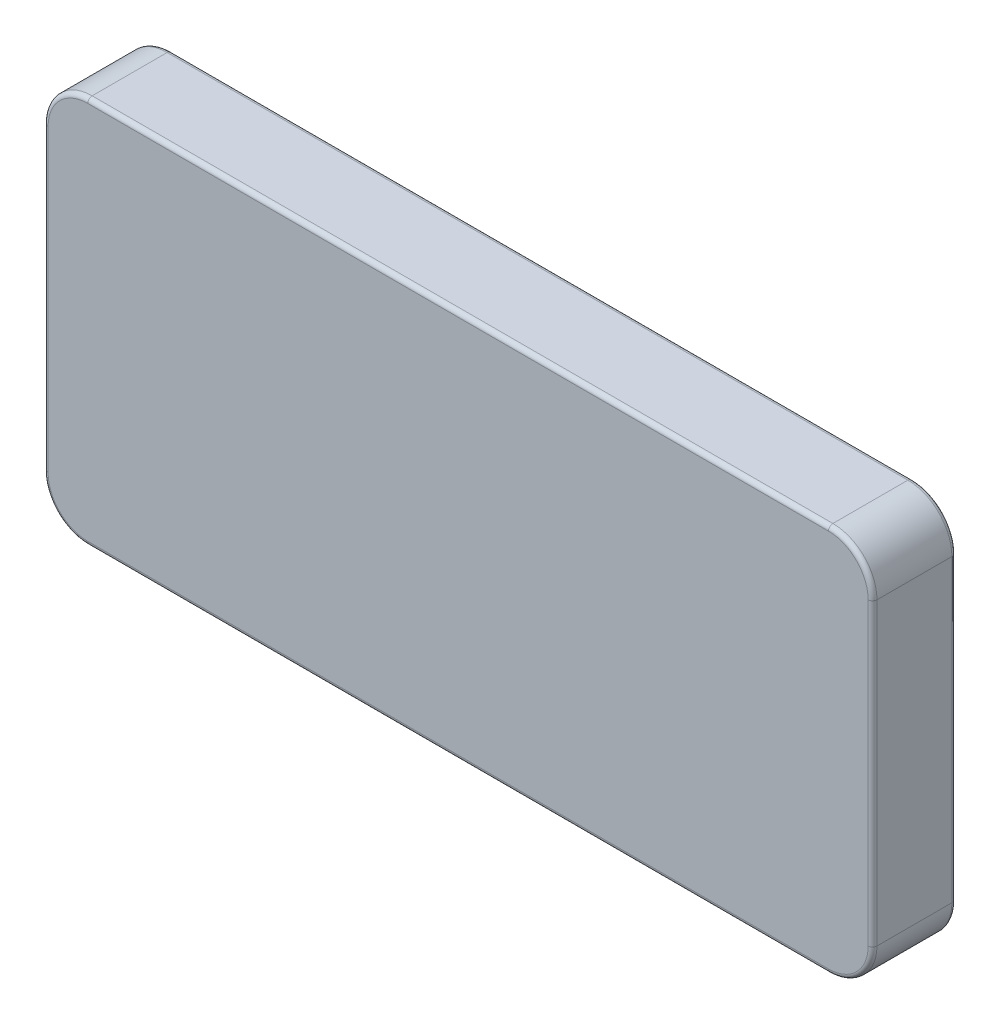
ISO-10303-21;
HEADER;
FILE_DESCRIPTION(('STEP AP214'),'2;1');
FILE_NAME('part.step','',(''),(''),'','','');
FILE_SCHEMA(('AUTOMOTIVE_DESIGN { 1 0 10303 214 1 1 1 1 }'));
ENDSEC;
DATA;
#1=APPLICATION_CONTEXT('core data for automotive mechanical design processes');
#2=APPLICATION_PROTOCOL_DEFINITION('international standard','automotive_design',2000,#1);
#3=PRODUCT_CONTEXT('',#1,'mechanical');
#4=PRODUCT('Part','Part','',(#3));
#5=PRODUCT_RELATED_PRODUCT_CATEGORY('part','',(#4));
#6=PRODUCT_DEFINITION_FORMATION('','',#4);
#7=PRODUCT_DEFINITION_CONTEXT('part definition',#1,'design');
#8=PRODUCT_DEFINITION('design','',#6,#7);
#9=PRODUCT_DEFINITION_SHAPE('','',#8);
#10=(LENGTH_UNIT() NAMED_UNIT(*) SI_UNIT(.MILLI.,.METRE.));
#11=(NAMED_UNIT(*) PLANE_ANGLE_UNIT() SI_UNIT($,.RADIAN.));
#12=(NAMED_UNIT(*) SI_UNIT($,.STERADIAN.) SOLID_ANGLE_UNIT());
#13=UNCERTAINTY_MEASURE_WITH_UNIT(LENGTH_MEASURE(1.E-05),#10,'distance_accuracy_value','');
#14=(GEOMETRIC_REPRESENTATION_CONTEXT(3) GLOBAL_UNCERTAINTY_ASSIGNED_CONTEXT((#13)) GLOBAL_UNIT_ASSIGNED_CONTEXT((#10,
#11,#12)) REPRESENTATION_CONTEXT('',''));
#15=CARTESIAN_POINT('',(0.,0.,0.));
#16=DIRECTION('',(0.,0.,1.));
#17=DIRECTION('',(1.,0.,0.));
#18=AXIS2_PLACEMENT_3D('',#15,#16,#17);
#19=CARTESIAN_POINT('',(0.,0.,190.));
#20=DIRECTION('',(1.,0.,0.));
#21=DIRECTION('',(0.,0.,-1.));
#22=AXIS2_PLACEMENT_3D('',#19,#20,#21);
#23=PLANE('',#22);
#24=DIRECTION('',(0.,0.,-1.));
#25=VECTOR('',#24,1.);
#26=CARTESIAN_POINT('',(0.,780.,190.));
#27=LINE('',#26,#25);
#28=CARTESIAN_POINT('',(0.,780.,180.));
#29=VERTEX_POINT('',#28);
#30=CARTESIAN_POINT('',(0.,780.,10.));
#31=VERTEX_POINT('',#30);
#32=EDGE_CURVE('E280',#29,#31,#27,.T.);
#33=ORIENTED_EDGE('',*,*,#32,.T.);
#34=DIRECTION('',(0.,-1.,0.));
#35=VECTOR('',#34,1.);
#36=CARTESIAN_POINT('',(0.,100.,10.));
#37=LINE('',#36,#35);
#38=CARTESIAN_POINT('',(0.,100.,10.));
#39=VERTEX_POINT('',#38);
#40=EDGE_CURVE('E207',#31,#39,#37,.T.);
#41=ORIENTED_EDGE('',*,*,#40,.T.);
#42=DIRECTION('',(0.,0.,-1.));
#43=VECTOR('',#42,1.);
#44=CARTESIAN_POINT('',(0.,100.,190.));
#45=LINE('',#44,#43);
#46=CARTESIAN_POINT('',(0.,100.,180.));
#47=VERTEX_POINT('',#46);
#48=EDGE_CURVE('E238',#39,#47,#45,.F.);
#49=ORIENTED_EDGE('',*,*,#48,.T.);
#50=DIRECTION('',(0.,-1.,0.));
#51=VECTOR('',#50,1.);
#52=CARTESIAN_POINT('',(0.,0.,180.));
#53=LINE('',#52,#51);
#54=EDGE_CURVE('E205',#47,#29,#53,.F.);
#55=ORIENTED_EDGE('',*,*,#54,.T.);
#56=EDGE_LOOP('',(#33,#41,#49,#55));
#57=FACE_BOUND('',#56,.T.);
#58=ADVANCED_FACE('F33',(#57),#23,.F.);
#59=CARTESIAN_POINT('',(0.,0.,190.));
#60=DIRECTION('',(0.,1.,0.));
#61=DIRECTION('',(0.,0.,1.));
#62=AXIS2_PLACEMENT_3D('',#59,#60,#61);
#63=PLANE('',#62);
#64=DIRECTION('',(0.,0.,-1.));
#65=VECTOR('',#64,1.);
#66=CARTESIAN_POINT('',(100.,0.,190.));
#67=LINE('',#66,#65);
#68=CARTESIAN_POINT('',(100.,0.,180.));
#69=VERTEX_POINT('',#68);
#70=CARTESIAN_POINT('',(100.,0.,10.));
#71=VERTEX_POINT('',#70);
#72=EDGE_CURVE('E276',#69,#71,#67,.T.);
#73=ORIENTED_EDGE('',*,*,#72,.T.);
#74=DIRECTION('',(1.,0.,0.));
#75=VECTOR('',#74,1.);
#76=CARTESIAN_POINT('',(1780.,0.,10.));
#77=LINE('',#76,#75);
#78=CARTESIAN_POINT('',(1780.,0.,10.));
#79=VERTEX_POINT('',#78);
#80=EDGE_CURVE('E182',#71,#79,#77,.T.);
#81=ORIENTED_EDGE('',*,*,#80,.T.);
#82=DIRECTION('',(0.,0.,-1.));
#83=VECTOR('',#82,1.);
#84=CARTESIAN_POINT('',(1780.,0.,190.));
#85=LINE('',#84,#83);
#86=CARTESIAN_POINT('',(1780.,0.,180.));
#87=VERTEX_POINT('',#86);
#88=EDGE_CURVE('E290',#79,#87,#85,.F.);
#89=ORIENTED_EDGE('',*,*,#88,.T.);
#90=DIRECTION('',(1.,0.,0.));
#91=VECTOR('',#90,1.);
#92=CARTESIAN_POINT('',(0.,0.,180.));
#93=LINE('',#92,#91);
#94=EDGE_CURVE('E180',#87,#69,#93,.F.);
#95=ORIENTED_EDGE('',*,*,#94,.T.);
#96=EDGE_LOOP('',(#73,#81,#89,#95));
#97=FACE_BOUND('',#96,.T.);
#98=ADVANCED_FACE('F317',(#97),#63,.F.);
#99=CARTESIAN_POINT('',(1880.,0.,190.));
#100=DIRECTION('',(-1.,0.,0.));
#101=DIRECTION('',(0.,0.,1.));
#102=AXIS2_PLACEMENT_3D('',#99,#100,#101);
#103=PLANE('',#102);
#104=DIRECTION('',(0.,0.,-1.));
#105=VECTOR('',#104,1.);
#106=CARTESIAN_POINT('',(1880.,100.,190.));
#107=LINE('',#106,#105);
#108=CARTESIAN_POINT('',(1880.,100.,180.));
#109=VERTEX_POINT('',#108);
#110=CARTESIAN_POINT('',(1880.,100.,10.));
#111=VERTEX_POINT('',#110);
#112=EDGE_CURVE('E166',#109,#111,#107,.T.);
#113=ORIENTED_EDGE('',*,*,#112,.T.);
#114=DIRECTION('',(0.,1.,0.));
#115=VECTOR('',#114,1.);
#116=CARTESIAN_POINT('',(1880.,780.,10.));
#117=LINE('',#116,#115);
#118=CARTESIAN_POINT('',(1880.,780.,10.));
#119=VERTEX_POINT('',#118);
#120=EDGE_CURVE('E190',#111,#119,#117,.T.);
#121=ORIENTED_EDGE('',*,*,#120,.T.);
#122=DIRECTION('',(0.,0.,-1.));
#123=VECTOR('',#122,1.);
#124=CARTESIAN_POINT('',(1880.,780.,190.));
#125=LINE('',#124,#123);
#126=CARTESIAN_POINT('',(1880.,780.,180.));
#127=VERTEX_POINT('',#126);
#128=EDGE_CURVE('E294',#119,#127,#125,.F.);
#129=ORIENTED_EDGE('',*,*,#128,.T.);
#130=DIRECTION('',(0.,1.,0.));
#131=VECTOR('',#130,1.);
#132=CARTESIAN_POINT('',(1880.,0.,180.));
#133=LINE('',#132,#131);
#134=EDGE_CURVE('E188',#127,#109,#133,.F.);
#135=ORIENTED_EDGE('',*,*,#134,.T.);
#136=EDGE_LOOP('',(#113,#121,#129,#135));
#137=FACE_BOUND('',#136,.T.);
#138=ADVANCED_FACE('F361',(#137),#103,.F.);
#139=CARTESIAN_POINT('',(0.,880.,190.));
#140=DIRECTION('',(0.,-1.,0.));
#141=DIRECTION('',(0.,0.,-1.));
#142=AXIS2_PLACEMENT_3D('',#139,#140,#141);
#143=PLANE('',#142);
#144=DIRECTION('',(0.,0.,-1.));
#145=VECTOR('',#144,1.);
#146=CARTESIAN_POINT('',(1780.,880.,190.));
#147=LINE('',#146,#145);
#148=CARTESIAN_POINT('',(1780.,880.,180.));
#149=VERTEX_POINT('',#148);
#150=CARTESIAN_POINT('',(1780.,880.,10.));
#151=VERTEX_POINT('',#150);
#152=EDGE_CURVE('E282',#149,#151,#147,.T.);
#153=ORIENTED_EDGE('',*,*,#152,.T.);
#154=DIRECTION('',(-1.,0.,0.));
#155=VECTOR('',#154,1.);
#156=CARTESIAN_POINT('',(100.,880.,10.));
#157=LINE('',#156,#155);
#158=CARTESIAN_POINT('',(100.,880.,10.));
#159=VERTEX_POINT('',#158);
#160=EDGE_CURVE('E199',#151,#159,#157,.T.);
#161=ORIENTED_EDGE('',*,*,#160,.T.);
#162=DIRECTION('',(0.,0.,-1.));
#163=VECTOR('',#162,1.);
#164=CARTESIAN_POINT('',(100.,880.,190.));
#165=LINE('',#164,#163);
#166=CARTESIAN_POINT('',(100.,880.,180.));
#167=VERTEX_POINT('',#166);
#168=EDGE_CURVE('E287',#159,#167,#165,.F.);
#169=ORIENTED_EDGE('',*,*,#168,.T.);
#170=DIRECTION('',(-1.,0.,0.));
#171=VECTOR('',#170,1.);
#172=CARTESIAN_POINT('',(0.,880.,180.));
#173=LINE('',#172,#171);
#174=EDGE_CURVE('E197',#167,#149,#173,.F.);
#175=ORIENTED_EDGE('',*,*,#174,.T.);
#176=EDGE_LOOP('',(#153,#161,#169,#175));
#177=FACE_BOUND('',#176,.T.);
#178=ADVANCED_FACE('F345',(#177),#143,.F.);
#179=CARTESIAN_POINT('',(0.,0.,190.));
#180=DIRECTION('',(0.,0.,-1.));
#181=DIRECTION('',(-1.,0.,0.));
#182=AXIS2_PLACEMENT_3D('',#179,#180,#181);
#183=PLANE('',#182);
#184=DIRECTION('',(0.,1.,0.));
#185=VECTOR('',#184,1.);
#186=CARTESIAN_POINT('',(1870.,0.,190.));
#187=LINE('',#186,#185);
#188=CARTESIAN_POINT('',(1870.,100.,190.));
#189=VERTEX_POINT('',#188);
#190=CARTESIAN_POINT('',(1870.,780.,190.));
#191=VERTEX_POINT('',#190);
#192=EDGE_CURVE('E42',#189,#191,#187,.T.);
#193=ORIENTED_EDGE('',*,*,#192,.T.);
#194=CARTESIAN_POINT('',(1780.,780.,190.));
#195=DIRECTION('',(0.,0.,-1.));
#196=DIRECTION('',(-1.,0.,0.));
#197=AXIS2_PLACEMENT_3D('',#194,#195,#196);
#198=CIRCLE('',#197,90.);
#199=CARTESIAN_POINT('',(1780.,870.,190.));
#200=VERTEX_POINT('',#199);
#201=EDGE_CURVE('E11',#191,#200,#198,.F.);
#202=ORIENTED_EDGE('',*,*,#201,.T.);
#203=DIRECTION('',(-1.,0.,0.));
#204=VECTOR('',#203,1.);
#205=CARTESIAN_POINT('',(0.,870.,190.));
#206=LINE('',#205,#204);
#207=CARTESIAN_POINT('',(100.,870.,190.));
#208=VERTEX_POINT('',#207);
#209=EDGE_CURVE('E209',#200,#208,#206,.T.);
#210=ORIENTED_EDGE('',*,*,#209,.T.);
#211=CARTESIAN_POINT('',(100.,780.,190.));
#212=DIRECTION('',(0.,0.,-1.));
#213=DIRECTION('',(-1.,0.,0.));
#214=AXIS2_PLACEMENT_3D('',#211,#212,#213);
#215=CIRCLE('',#214,90.);
#216=CARTESIAN_POINT('',(10.,780.,190.));
#217=VERTEX_POINT('',#216);
#218=EDGE_CURVE('E211',#208,#217,#215,.F.);
#219=ORIENTED_EDGE('',*,*,#218,.T.);
#220=DIRECTION('',(0.,-1.,0.));
#221=VECTOR('',#220,1.);
#222=CARTESIAN_POINT('',(10.,0.,190.));
#223=LINE('',#222,#221);
#224=CARTESIAN_POINT('',(10.,100.,190.));
#225=VERTEX_POINT('',#224);
#226=EDGE_CURVE('E213',#217,#225,#223,.T.);
#227=ORIENTED_EDGE('',*,*,#226,.T.);
#228=CARTESIAN_POINT('',(100.,100.,190.));
#229=DIRECTION('',(0.,0.,-1.));
#230=DIRECTION('',(-1.,0.,0.));
#231=AXIS2_PLACEMENT_3D('',#228,#229,#230);
#232=CIRCLE('',#231,90.);
#233=CARTESIAN_POINT('',(100.,9.99999999999998,190.));
#234=VERTEX_POINT('',#233);
#235=EDGE_CURVE('E215',#225,#234,#232,.F.);
#236=ORIENTED_EDGE('',*,*,#235,.T.);
#237=DIRECTION('',(1.,0.,0.));
#238=VECTOR('',#237,1.);
#239=CARTESIAN_POINT('',(0.,10.,190.));
#240=LINE('',#239,#238);
#241=CARTESIAN_POINT('',(1780.,10.,190.));
#242=VERTEX_POINT('',#241);
#243=EDGE_CURVE('E217',#234,#242,#240,.T.);
#244=ORIENTED_EDGE('',*,*,#243,.T.);
#245=CARTESIAN_POINT('',(1780.,100.,190.));
#246=DIRECTION('',(0.,0.,-1.));
#247=DIRECTION('',(-1.,0.,0.));
#248=AXIS2_PLACEMENT_3D('',#245,#246,#247);
#249=CIRCLE('',#248,90.);
#250=EDGE_CURVE('E53',#242,#189,#249,.F.);
#251=ORIENTED_EDGE('',*,*,#250,.T.);
#252=EDGE_LOOP('',(#193,#202,#210,#219,#227,#236,#244,#251));
#253=FACE_BOUND('',#252,.T.);
#254=ADVANCED_FACE('F333',(#253),#183,.F.);
#255=CARTESIAN_POINT('',(0.,0.,0.));
#256=DIRECTION('',(0.,0.,-1.));
#257=DIRECTION('',(-1.,0.,0.));
#258=AXIS2_PLACEMENT_3D('',#255,#256,#257);
#259=PLANE('',#258);
#260=DIRECTION('',(1.,0.,0.));
#261=VECTOR('',#260,1.);
#262=CARTESIAN_POINT('',(100.,10.,0.));
#263=LINE('',#262,#261);
#264=CARTESIAN_POINT('',(1780.,9.99999999999998,0.));
#265=VERTEX_POINT('',#264);
#266=CARTESIAN_POINT('',(100.,10.,0.));
#267=VERTEX_POINT('',#266);
#268=EDGE_CURVE('E170',#265,#267,#263,.F.);
#269=ORIENTED_EDGE('',*,*,#268,.T.);
#270=CARTESIAN_POINT('',(100.,100.,0.));
#271=DIRECTION('',(0.,0.,-1.));
#272=DIRECTION('',(-1.,0.,0.));
#273=AXIS2_PLACEMENT_3D('',#270,#271,#272);
#274=CIRCLE('',#273,90.);
#275=CARTESIAN_POINT('',(10.,100.,0.));
#276=VERTEX_POINT('',#275);
#277=EDGE_CURVE('E151',#267,#276,#274,.T.);
#278=ORIENTED_EDGE('',*,*,#277,.T.);
#279=DIRECTION('',(0.,-1.,0.));
#280=VECTOR('',#279,1.);
#281=CARTESIAN_POINT('',(10.,780.,0.));
#282=LINE('',#281,#280);
#283=CARTESIAN_POINT('',(10.,780.,0.));
#284=VERTEX_POINT('',#283);
#285=EDGE_CURVE('E159',#276,#284,#282,.F.);
#286=ORIENTED_EDGE('',*,*,#285,.T.);
#287=CARTESIAN_POINT('',(100.,780.,0.));
#288=DIRECTION('',(0.,0.,-1.));
#289=DIRECTION('',(-1.,0.,0.));
#290=AXIS2_PLACEMENT_3D('',#287,#288,#289);
#291=CIRCLE('',#290,90.);
#292=CARTESIAN_POINT('',(100.,870.,0.));
#293=VERTEX_POINT('',#292);
#294=EDGE_CURVE('E165',#284,#293,#291,.T.);
#295=ORIENTED_EDGE('',*,*,#294,.T.);
#296=DIRECTION('',(-1.,0.,0.));
#297=VECTOR('',#296,1.);
#298=CARTESIAN_POINT('',(1780.,870.,0.));
#299=LINE('',#298,#297);
#300=CARTESIAN_POINT('',(1780.,870.,0.));
#301=VERTEX_POINT('',#300);
#302=EDGE_CURVE('E300',#293,#301,#299,.F.);
#303=ORIENTED_EDGE('',*,*,#302,.T.);
#304=CARTESIAN_POINT('',(1780.,780.,0.));
#305=DIRECTION('',(0.,0.,-1.));
#306=DIRECTION('',(-1.,0.,0.));
#307=AXIS2_PLACEMENT_3D('',#304,#305,#306);
#308=CIRCLE('',#307,90.);
#309=CARTESIAN_POINT('',(1870.,780.,0.));
#310=VERTEX_POINT('',#309);
#311=EDGE_CURVE('E302',#301,#310,#308,.T.);
#312=ORIENTED_EDGE('',*,*,#311,.T.);
#313=DIRECTION('',(0.,1.,0.));
#314=VECTOR('',#313,1.);
#315=CARTESIAN_POINT('',(1870.,100.,0.));
#316=LINE('',#315,#314);
#317=CARTESIAN_POINT('',(1870.,100.,0.));
#318=VERTEX_POINT('',#317);
#319=EDGE_CURVE('E304',#310,#318,#316,.F.);
#320=ORIENTED_EDGE('',*,*,#319,.T.);
#321=CARTESIAN_POINT('',(1780.,100.,0.));
#322=DIRECTION('',(0.,0.,-1.));
#323=DIRECTION('',(-1.,0.,0.));
#324=AXIS2_PLACEMENT_3D('',#321,#322,#323);
#325=CIRCLE('',#324,90.);
#326=EDGE_CURVE('E175',#318,#265,#325,.T.);
#327=ORIENTED_EDGE('',*,*,#326,.T.);
#328=EDGE_LOOP('',(#269,#278,#286,#295,#303,#312,#320,#327));
#329=FACE_BOUND('',#328,.T.);
#330=ADVANCED_FACE('F168',(#329),#259,.T.);
#331=CARTESIAN_POINT('',(100.,780.,190.));
#332=DIRECTION('',(0.,0.,-1.));
#333=DIRECTION('',(-1.,0.,0.));
#334=AXIS2_PLACEMENT_3D('',#331,#332,#333);
#335=CYLINDRICAL_SURFACE('',#334,100.);
#336=ORIENTED_EDGE('',*,*,#168,.F.);
#337=CARTESIAN_POINT('',(100.,780.,10.));
#338=DIRECTION('',(0.,0.,-1.));
#339=DIRECTION('',(-1.,0.,0.));
#340=AXIS2_PLACEMENT_3D('',#337,#338,#339);
#341=CIRCLE('',#340,100.);
#342=EDGE_CURVE('E203',#159,#31,#341,.F.);
#343=ORIENTED_EDGE('',*,*,#342,.T.);
#344=ORIENTED_EDGE('',*,*,#32,.F.);
#345=CARTESIAN_POINT('',(100.,780.,180.));
#346=DIRECTION('',(0.,0.,-1.));
#347=DIRECTION('',(-1.,0.,0.));
#348=AXIS2_PLACEMENT_3D('',#345,#346,#347);
#349=CIRCLE('',#348,100.);
#350=EDGE_CURVE('E201',#29,#167,#349,.T.);
#351=ORIENTED_EDGE('',*,*,#350,.T.);
#352=EDGE_LOOP('',(#336,#343,#344,#351));
#353=FACE_BOUND('',#352,.T.);
#354=ADVANCED_FACE('F375',(#353),#335,.T.);
#355=CARTESIAN_POINT('',(100.,100.,190.));
#356=DIRECTION('',(0.,0.,-1.));
#357=DIRECTION('',(-1.,0.,0.));
#358=AXIS2_PLACEMENT_3D('',#355,#356,#357);
#359=CYLINDRICAL_SURFACE('',#358,100.);
#360=ORIENTED_EDGE('',*,*,#48,.F.);
#361=CARTESIAN_POINT('',(100.,100.,10.));
#362=DIRECTION('',(0.,0.,-1.));
#363=DIRECTION('',(-1.,0.,0.));
#364=AXIS2_PLACEMENT_3D('',#361,#362,#363);
#365=CIRCLE('',#364,100.);
#366=EDGE_CURVE('E153',#39,#71,#365,.F.);
#367=ORIENTED_EDGE('',*,*,#366,.T.);
#368=ORIENTED_EDGE('',*,*,#72,.F.);
#369=CARTESIAN_POINT('',(100.,100.,180.));
#370=DIRECTION('',(0.,0.,-1.));
#371=DIRECTION('',(-1.,0.,0.));
#372=AXIS2_PLACEMENT_3D('',#369,#370,#371);
#373=CIRCLE('',#372,100.);
#374=EDGE_CURVE('E172',#69,#47,#373,.T.);
#375=ORIENTED_EDGE('',*,*,#374,.T.);
#376=EDGE_LOOP('',(#360,#367,#368,#375));
#377=FACE_BOUND('',#376,.T.);
#378=ADVANCED_FACE('F274',(#377),#359,.T.);
#379=CARTESIAN_POINT('',(1780.,100.,190.));
#380=DIRECTION('',(0.,0.,-1.));
#381=DIRECTION('',(-1.,0.,0.));
#382=AXIS2_PLACEMENT_3D('',#379,#380,#381);
#383=CYLINDRICAL_SURFACE('',#382,100.);
#384=ORIENTED_EDGE('',*,*,#88,.F.);
#385=CARTESIAN_POINT('',(1780.,100.,10.));
#386=DIRECTION('',(0.,0.,-1.));
#387=DIRECTION('',(-1.,0.,0.));
#388=AXIS2_PLACEMENT_3D('',#385,#386,#387);
#389=CIRCLE('',#388,100.);
#390=EDGE_CURVE('E186',#79,#111,#389,.F.);
#391=ORIENTED_EDGE('',*,*,#390,.T.);
#392=ORIENTED_EDGE('',*,*,#112,.F.);
#393=CARTESIAN_POINT('',(1780.,100.,180.));
#394=DIRECTION('',(0.,0.,-1.));
#395=DIRECTION('',(-1.,0.,0.));
#396=AXIS2_PLACEMENT_3D('',#393,#394,#395);
#397=CIRCLE('',#396,100.);
#398=EDGE_CURVE('E184',#109,#87,#397,.T.);
#399=ORIENTED_EDGE('',*,*,#398,.T.);
#400=EDGE_LOOP('',(#384,#391,#392,#399));
#401=FACE_BOUND('',#400,.T.);
#402=ADVANCED_FACE('F319',(#401),#383,.T.);
#403=CARTESIAN_POINT('',(1780.,780.,190.));
#404=DIRECTION('',(0.,0.,-1.));
#405=DIRECTION('',(-1.,0.,0.));
#406=AXIS2_PLACEMENT_3D('',#403,#404,#405);
#407=CYLINDRICAL_SURFACE('',#406,100.);
#408=ORIENTED_EDGE('',*,*,#128,.F.);
#409=CARTESIAN_POINT('',(1780.,780.,10.));
#410=DIRECTION('',(0.,0.,-1.));
#411=DIRECTION('',(-1.,0.,0.));
#412=AXIS2_PLACEMENT_3D('',#409,#410,#411);
#413=CIRCLE('',#412,100.);
#414=EDGE_CURVE('E195',#119,#151,#413,.F.);
#415=ORIENTED_EDGE('',*,*,#414,.T.);
#416=ORIENTED_EDGE('',*,*,#152,.F.);
#417=CARTESIAN_POINT('',(1780.,780.,180.));
#418=DIRECTION('',(0.,0.,-1.));
#419=DIRECTION('',(-1.,0.,0.));
#420=AXIS2_PLACEMENT_3D('',#417,#418,#419);
#421=CIRCLE('',#420,100.);
#422=EDGE_CURVE('E192',#149,#127,#421,.T.);
#423=ORIENTED_EDGE('',*,*,#422,.T.);
#424=EDGE_LOOP('',(#408,#415,#416,#423));
#425=FACE_BOUND('',#424,.T.);
#426=ADVANCED_FACE('F350',(#425),#407,.T.);
#427=CARTESIAN_POINT('',(1780.,780.,10.));
#428=DIRECTION('',(0.,0.,-1.));
#429=DIRECTION('',(-1.,0.,0.));
#430=AXIS2_PLACEMENT_3D('',#427,#428,#429);
#431=TOROIDAL_SURFACE('',#430,90.,10.);
#432=CARTESIAN_POINT('',(1780.,870.,10.));
#433=DIRECTION('',(-1.,0.,0.));
#434=DIRECTION('',(0.,0.,1.));
#435=AXIS2_PLACEMENT_3D('',#432,#433,#434);
#436=CIRCLE('',#435,10.);
#437=EDGE_CURVE('E232',#151,#301,#436,.T.);
#438=ORIENTED_EDGE('',*,*,#437,.F.);
#439=ORIENTED_EDGE('',*,*,#414,.F.);
#440=CARTESIAN_POINT('',(1870.,780.,10.));
#441=DIRECTION('',(0.,-1.,0.));
#442=DIRECTION('',(0.,0.,-1.));
#443=AXIS2_PLACEMENT_3D('',#440,#441,#442);
#444=CIRCLE('',#443,10.);
#445=EDGE_CURVE('E235',#310,#119,#444,.T.);
#446=ORIENTED_EDGE('',*,*,#445,.F.);
#447=ORIENTED_EDGE('',*,*,#311,.F.);
#448=EDGE_LOOP('',(#438,#439,#446,#447));
#449=FACE_BOUND('',#448,.T.);
#450=ADVANCED_FACE('F354',(#449),#431,.T.);
#451=CARTESIAN_POINT('',(1870.,0.,10.));
#452=DIRECTION('',(0.,-1.,0.));
#453=DIRECTION('',(0.,0.,-1.));
#454=AXIS2_PLACEMENT_3D('',#451,#452,#453);
#455=CYLINDRICAL_SURFACE('',#454,10.);
#456=ORIENTED_EDGE('',*,*,#445,.T.);
#457=ORIENTED_EDGE('',*,*,#120,.F.);
#458=CARTESIAN_POINT('',(1870.,100.,10.));
#459=DIRECTION('',(0.,-1.,0.));
#460=DIRECTION('',(0.,0.,-1.));
#461=AXIS2_PLACEMENT_3D('',#458,#459,#460);
#462=CIRCLE('',#461,10.);
#463=EDGE_CURVE('E229',#318,#111,#462,.T.);
#464=ORIENTED_EDGE('',*,*,#463,.F.);
#465=ORIENTED_EDGE('',*,*,#319,.F.);
#466=EDGE_LOOP('',(#456,#457,#464,#465));
#467=FACE_BOUND('',#466,.T.);
#468=ADVANCED_FACE('F359',(#467),#455,.T.);
#469=CARTESIAN_POINT('',(0.,870.,10.));
#470=DIRECTION('',(1.,0.,0.));
#471=DIRECTION('',(0.,0.,-1.));
#472=AXIS2_PLACEMENT_3D('',#469,#470,#471);
#473=CYLINDRICAL_SURFACE('',#472,10.);
#474=ORIENTED_EDGE('',*,*,#437,.T.);
#475=ORIENTED_EDGE('',*,*,#302,.F.);
#476=CARTESIAN_POINT('',(100.,870.,10.));
#477=DIRECTION('',(-1.,0.,0.));
#478=DIRECTION('',(0.,0.,1.));
#479=AXIS2_PLACEMENT_3D('',#476,#477,#478);
#480=CIRCLE('',#479,10.);
#481=EDGE_CURVE('E226',#159,#293,#480,.T.);
#482=ORIENTED_EDGE('',*,*,#481,.F.);
#483=ORIENTED_EDGE('',*,*,#160,.F.);
#484=EDGE_LOOP('',(#474,#475,#482,#483));
#485=FACE_BOUND('',#484,.T.);
#486=ADVANCED_FACE('F397',(#485),#473,.T.);
#487=CARTESIAN_POINT('',(1780.,100.,10.));
#488=DIRECTION('',(0.,0.,-1.));
#489=DIRECTION('',(-1.,0.,0.));
#490=AXIS2_PLACEMENT_3D('',#487,#488,#489);
#491=TOROIDAL_SURFACE('',#490,90.,10.);
#492=ORIENTED_EDGE('',*,*,#463,.T.);
#493=ORIENTED_EDGE('',*,*,#390,.F.);
#494=CARTESIAN_POINT('',(1780.,9.99999999999998,10.));
#495=DIRECTION('',(-1.,0.,0.));
#496=DIRECTION('',(0.,0.,1.));
#497=AXIS2_PLACEMENT_3D('',#494,#495,#496);
#498=CIRCLE('',#497,10.);
#499=EDGE_CURVE('E223',#265,#79,#498,.T.);
#500=ORIENTED_EDGE('',*,*,#499,.F.);
#501=ORIENTED_EDGE('',*,*,#326,.F.);
#502=EDGE_LOOP('',(#492,#493,#500,#501));
#503=FACE_BOUND('',#502,.T.);
#504=ADVANCED_FACE('F311',(#503),#491,.T.);
#505=CARTESIAN_POINT('',(100.,780.,10.));
#506=DIRECTION('',(0.,0.,-1.));
#507=DIRECTION('',(-1.,0.,0.));
#508=AXIS2_PLACEMENT_3D('',#505,#506,#507);
#509=TOROIDAL_SURFACE('',#508,90.,10.);
#510=ORIENTED_EDGE('',*,*,#481,.T.);
#511=ORIENTED_EDGE('',*,*,#294,.F.);
#512=CARTESIAN_POINT('',(10.,780.,10.));
#513=DIRECTION('',(0.,-1.,0.));
#514=DIRECTION('',(0.,0.,-1.));
#515=AXIS2_PLACEMENT_3D('',#512,#513,#514);
#516=CIRCLE('',#515,10.);
#517=EDGE_CURVE('E162',#31,#284,#516,.T.);
#518=ORIENTED_EDGE('',*,*,#517,.F.);
#519=ORIENTED_EDGE('',*,*,#342,.F.);
#520=EDGE_LOOP('',(#510,#511,#518,#519));
#521=FACE_BOUND('',#520,.T.);
#522=ADVANCED_FACE('F391',(#521),#509,.T.);
#523=CARTESIAN_POINT('',(0.,10.,10.));
#524=DIRECTION('',(-1.,0.,0.));
#525=DIRECTION('',(0.,0.,1.));
#526=AXIS2_PLACEMENT_3D('',#523,#524,#525);
#527=CYLINDRICAL_SURFACE('',#526,10.);
#528=ORIENTED_EDGE('',*,*,#499,.T.);
#529=ORIENTED_EDGE('',*,*,#80,.F.);
#530=CARTESIAN_POINT('',(100.,10.,10.));
#531=DIRECTION('',(-1.,0.,0.));
#532=DIRECTION('',(0.,0.,1.));
#533=AXIS2_PLACEMENT_3D('',#530,#531,#532);
#534=CIRCLE('',#533,10.);
#535=EDGE_CURVE('E156',#267,#71,#534,.T.);
#536=ORIENTED_EDGE('',*,*,#535,.F.);
#537=ORIENTED_EDGE('',*,*,#268,.F.);
#538=EDGE_LOOP('',(#528,#529,#536,#537));
#539=FACE_BOUND('',#538,.T.);
#540=ADVANCED_FACE('F314',(#539),#527,.T.);
#541=CARTESIAN_POINT('',(10.,0.,10.));
#542=DIRECTION('',(0.,1.,0.));
#543=DIRECTION('',(0.,0.,1.));
#544=AXIS2_PLACEMENT_3D('',#541,#542,#543);
#545=CYLINDRICAL_SURFACE('',#544,10.);
#546=ORIENTED_EDGE('',*,*,#517,.T.);
#547=ORIENTED_EDGE('',*,*,#285,.F.);
#548=CARTESIAN_POINT('',(10.,100.,10.));
#549=DIRECTION('',(0.,-1.,0.));
#550=DIRECTION('',(0.,0.,-1.));
#551=AXIS2_PLACEMENT_3D('',#548,#549,#550);
#552=CIRCLE('',#551,10.);
#553=EDGE_CURVE('E147',#39,#276,#552,.T.);
#554=ORIENTED_EDGE('',*,*,#553,.F.);
#555=ORIENTED_EDGE('',*,*,#40,.F.);
#556=EDGE_LOOP('',(#546,#547,#554,#555));
#557=FACE_BOUND('',#556,.T.);
#558=ADVANCED_FACE('F160',(#557),#545,.T.);
#559=CARTESIAN_POINT('',(100.,100.,10.));
#560=DIRECTION('',(0.,0.,-1.));
#561=DIRECTION('',(-1.,0.,0.));
#562=AXIS2_PLACEMENT_3D('',#559,#560,#561);
#563=TOROIDAL_SURFACE('',#562,90.,10.);
#564=ORIENTED_EDGE('',*,*,#535,.T.);
#565=ORIENTED_EDGE('',*,*,#366,.F.);
#566=ORIENTED_EDGE('',*,*,#553,.T.);
#567=ORIENTED_EDGE('',*,*,#277,.F.);
#568=EDGE_LOOP('',(#564,#565,#566,#567));
#569=FACE_BOUND('',#568,.T.);
#570=ADVANCED_FACE('F149',(#569),#563,.T.);
#571=CARTESIAN_POINT('',(100.,100.,180.));
#572=DIRECTION('',(0.,0.,-1.));
#573=DIRECTION('',(-1.,0.,0.));
#574=AXIS2_PLACEMENT_3D('',#571,#572,#573);
#575=TOROIDAL_SURFACE('',#574,90.,10.);
#576=CARTESIAN_POINT('',(10.,100.,180.));
#577=DIRECTION('',(0.,1.,0.));
#578=DIRECTION('',(0.,0.,1.));
#579=AXIS2_PLACEMENT_3D('',#576,#577,#578);
#580=CIRCLE('',#579,10.);
#581=EDGE_CURVE('E254',#47,#225,#580,.T.);
#582=ORIENTED_EDGE('',*,*,#581,.F.);
#583=ORIENTED_EDGE('',*,*,#374,.F.);
#584=CARTESIAN_POINT('',(100.,9.99999999999998,180.));
#585=DIRECTION('',(1.,0.,0.));
#586=DIRECTION('',(0.,0.,-1.));
#587=AXIS2_PLACEMENT_3D('',#584,#585,#586);
#588=CIRCLE('',#587,10.);
#589=EDGE_CURVE('E37',#234,#69,#588,.T.);
#590=ORIENTED_EDGE('',*,*,#589,.F.);
#591=ORIENTED_EDGE('',*,*,#235,.F.);
#592=EDGE_LOOP('',(#582,#583,#590,#591));
#593=FACE_BOUND('',#592,.T.);
#594=ADVANCED_FACE('F35',(#593),#575,.T.);
#595=CARTESIAN_POINT('',(0.,10.,180.));
#596=DIRECTION('',(1.,0.,0.));
#597=DIRECTION('',(0.,0.,-1.));
#598=AXIS2_PLACEMENT_3D('',#595,#596,#597);
#599=CYLINDRICAL_SURFACE('',#598,10.);
#600=ORIENTED_EDGE('',*,*,#589,.T.);
#601=ORIENTED_EDGE('',*,*,#94,.F.);
#602=CARTESIAN_POINT('',(1780.,10.,180.));
#603=DIRECTION('',(1.,0.,0.));
#604=DIRECTION('',(0.,0.,-1.));
#605=AXIS2_PLACEMENT_3D('',#602,#603,#604);
#606=CIRCLE('',#605,10.);
#607=EDGE_CURVE('E252',#242,#87,#606,.T.);
#608=ORIENTED_EDGE('',*,*,#607,.F.);
#609=ORIENTED_EDGE('',*,*,#243,.F.);
#610=EDGE_LOOP('',(#600,#601,#608,#609));
#611=FACE_BOUND('',#610,.T.);
#612=ADVANCED_FACE('F265',(#611),#599,.T.);
#613=CARTESIAN_POINT('',(10.,0.,180.));
#614=DIRECTION('',(0.,-1.,0.));
#615=DIRECTION('',(0.,0.,-1.));
#616=AXIS2_PLACEMENT_3D('',#613,#614,#615);
#617=CYLINDRICAL_SURFACE('',#616,10.);
#618=ORIENTED_EDGE('',*,*,#581,.T.);
#619=ORIENTED_EDGE('',*,*,#226,.F.);
#620=CARTESIAN_POINT('',(10.,780.,180.));
#621=DIRECTION('',(0.,1.,0.));
#622=DIRECTION('',(0.,0.,1.));
#623=AXIS2_PLACEMENT_3D('',#620,#621,#622);
#624=CIRCLE('',#623,10.);
#625=EDGE_CURVE('E249',#29,#217,#624,.T.);
#626=ORIENTED_EDGE('',*,*,#625,.F.);
#627=ORIENTED_EDGE('',*,*,#54,.F.);
#628=EDGE_LOOP('',(#618,#619,#626,#627));
#629=FACE_BOUND('',#628,.T.);
#630=ADVANCED_FACE('F415',(#629),#617,.T.);
#631=CARTESIAN_POINT('',(1780.,100.,180.));
#632=DIRECTION('',(0.,0.,-1.));
#633=DIRECTION('',(-1.,0.,0.));
#634=AXIS2_PLACEMENT_3D('',#631,#632,#633);
#635=TOROIDAL_SURFACE('',#634,90.,10.);
#636=ORIENTED_EDGE('',*,*,#607,.T.);
#637=ORIENTED_EDGE('',*,*,#398,.F.);
#638=CARTESIAN_POINT('',(1870.,100.,180.));
#639=DIRECTION('',(0.,1.,0.));
#640=DIRECTION('',(0.,0.,1.));
#641=AXIS2_PLACEMENT_3D('',#638,#639,#640);
#642=CIRCLE('',#641,10.);
#643=EDGE_CURVE('E246',#189,#109,#642,.T.);
#644=ORIENTED_EDGE('',*,*,#643,.F.);
#645=ORIENTED_EDGE('',*,*,#250,.F.);
#646=EDGE_LOOP('',(#636,#637,#644,#645));
#647=FACE_BOUND('',#646,.T.);
#648=ADVANCED_FACE('F323',(#647),#635,.T.);
#649=CARTESIAN_POINT('',(100.,780.,180.));
#650=DIRECTION('',(0.,0.,-1.));
#651=DIRECTION('',(-1.,0.,0.));
#652=AXIS2_PLACEMENT_3D('',#649,#650,#651);
#653=TOROIDAL_SURFACE('',#652,90.,10.);
#654=ORIENTED_EDGE('',*,*,#625,.T.);
#655=ORIENTED_EDGE('',*,*,#218,.F.);
#656=CARTESIAN_POINT('',(100.,870.,180.));
#657=DIRECTION('',(1.,0.,0.));
#658=DIRECTION('',(0.,0.,-1.));
#659=AXIS2_PLACEMENT_3D('',#656,#657,#658);
#660=CIRCLE('',#659,10.);
#661=EDGE_CURVE('E243',#167,#208,#660,.T.);
#662=ORIENTED_EDGE('',*,*,#661,.F.);
#663=ORIENTED_EDGE('',*,*,#350,.F.);
#664=EDGE_LOOP('',(#654,#655,#662,#663));
#665=FACE_BOUND('',#664,.T.);
#666=ADVANCED_FACE('F338',(#665),#653,.T.);
#667=CARTESIAN_POINT('',(1870.,0.,180.));
#668=DIRECTION('',(0.,1.,0.));
#669=DIRECTION('',(0.,0.,1.));
#670=AXIS2_PLACEMENT_3D('',#667,#668,#669);
#671=CYLINDRICAL_SURFACE('',#670,10.);
#672=ORIENTED_EDGE('',*,*,#643,.T.);
#673=ORIENTED_EDGE('',*,*,#134,.F.);
#674=CARTESIAN_POINT('',(1870.,780.,180.));
#675=DIRECTION('',(0.,1.,0.));
#676=DIRECTION('',(0.,0.,1.));
#677=AXIS2_PLACEMENT_3D('',#674,#675,#676);
#678=CIRCLE('',#677,10.);
#679=EDGE_CURVE('E241',#191,#127,#678,.T.);
#680=ORIENTED_EDGE('',*,*,#679,.F.);
#681=ORIENTED_EDGE('',*,*,#192,.F.);
#682=EDGE_LOOP('',(#672,#673,#680,#681));
#683=FACE_BOUND('',#682,.T.);
#684=ADVANCED_FACE('F326',(#683),#671,.T.);
#685=CARTESIAN_POINT('',(0.,870.,180.));
#686=DIRECTION('',(-1.,0.,0.));
#687=DIRECTION('',(0.,0.,1.));
#688=AXIS2_PLACEMENT_3D('',#685,#686,#687);
#689=CYLINDRICAL_SURFACE('',#688,10.);
#690=ORIENTED_EDGE('',*,*,#661,.T.);
#691=ORIENTED_EDGE('',*,*,#209,.F.);
#692=CARTESIAN_POINT('',(1780.,870.,180.));
#693=DIRECTION('',(1.,0.,0.));
#694=DIRECTION('',(0.,0.,-1.));
#695=AXIS2_PLACEMENT_3D('',#692,#693,#694);
#696=CIRCLE('',#695,10.);
#697=EDGE_CURVE('E239',#149,#200,#696,.T.);
#698=ORIENTED_EDGE('',*,*,#697,.F.);
#699=ORIENTED_EDGE('',*,*,#174,.F.);
#700=EDGE_LOOP('',(#690,#691,#698,#699));
#701=FACE_BOUND('',#700,.T.);
#702=ADVANCED_FACE('F342',(#701),#689,.T.);
#703=CARTESIAN_POINT('',(1780.,780.,180.));
#704=DIRECTION('',(0.,0.,-1.));
#705=DIRECTION('',(-1.,0.,0.));
#706=AXIS2_PLACEMENT_3D('',#703,#704,#705);
#707=TOROIDAL_SURFACE('',#706,90.,10.);
#708=ORIENTED_EDGE('',*,*,#679,.T.);
#709=ORIENTED_EDGE('',*,*,#422,.F.);
#710=ORIENTED_EDGE('',*,*,#697,.T.);
#711=ORIENTED_EDGE('',*,*,#201,.F.);
#712=EDGE_LOOP('',(#708,#709,#710,#711));
#713=FACE_BOUND('',#712,.T.);
#714=ADVANCED_FACE('F330',(#713),#707,.T.);
#715=CLOSED_SHELL('',(#58,#98,#138,#178,#254,#330,#354,#378,#402,#426,#450,#468,#486,#504,#522,
#540,#558,#570,#594,#612,#630,#648,#666,#684,#702,#714));
#716=MANIFOLD_SOLID_BREP('B2',#715);
#717=ADVANCED_BREP_SHAPE_REPRESENTATION('',(#18,#716),#14);
#718=SHAPE_DEFINITION_REPRESENTATION(#9,#717);
ENDSEC;
END-ISO-10303-21;
